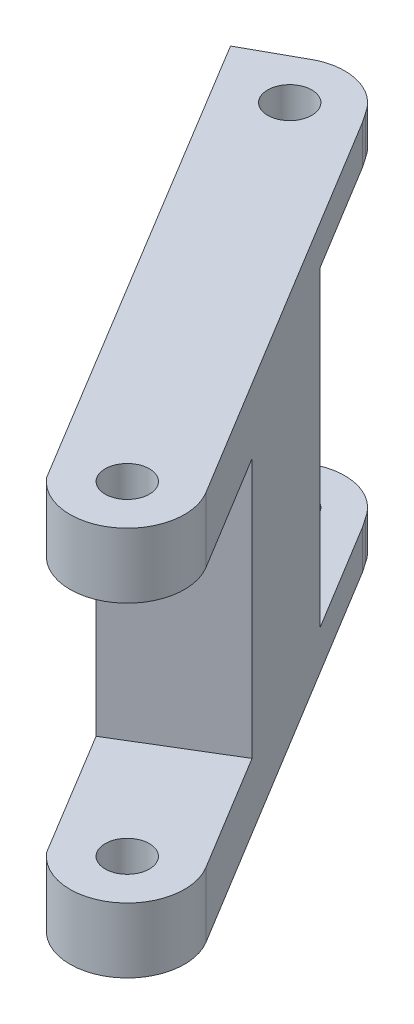
ISO-10303-21;
HEADER;
FILE_DESCRIPTION(('STEP AP214'),'2;1');
FILE_NAME('part.step','',(''),(''),'','','');
FILE_SCHEMA(('AUTOMOTIVE_DESIGN { 1 0 10303 214 1 1 1 1 }'));
ENDSEC;
DATA;
#1=APPLICATION_CONTEXT('core data for automotive mechanical design processes');
#2=APPLICATION_PROTOCOL_DEFINITION('international standard','automotive_design',2000,#1);
#3=PRODUCT_CONTEXT('',#1,'mechanical');
#4=PRODUCT('Part','Part','',(#3));
#5=PRODUCT_RELATED_PRODUCT_CATEGORY('part','',(#4));
#6=PRODUCT_DEFINITION_FORMATION('','',#4);
#7=PRODUCT_DEFINITION_CONTEXT('part definition',#1,'design');
#8=PRODUCT_DEFINITION('design','',#6,#7);
#9=PRODUCT_DEFINITION_SHAPE('','',#8);
#10=(LENGTH_UNIT() NAMED_UNIT(*) SI_UNIT(.MILLI.,.METRE.));
#11=(NAMED_UNIT(*) PLANE_ANGLE_UNIT() SI_UNIT($,.RADIAN.));
#12=(NAMED_UNIT(*) SI_UNIT($,.STERADIAN.) SOLID_ANGLE_UNIT());
#13=UNCERTAINTY_MEASURE_WITH_UNIT(LENGTH_MEASURE(1.E-05),#10,'distance_accuracy_value','');
#14=(GEOMETRIC_REPRESENTATION_CONTEXT(3) GLOBAL_UNCERTAINTY_ASSIGNED_CONTEXT((#13)) GLOBAL_UNIT_ASSIGNED_CONTEXT((#10,
#11,#12)) REPRESENTATION_CONTEXT('',''));
#15=CARTESIAN_POINT('',(0.,0.,0.));
#16=DIRECTION('',(0.,0.,1.));
#17=DIRECTION('',(1.,0.,0.));
#18=AXIS2_PLACEMENT_3D('',#15,#16,#17);
#19=CARTESIAN_POINT('',(15.902373856491,30.,-13.1472839893539));
#20=DIRECTION('',(0.,-1.,0.));
#21=DIRECTION('',(0.,0.,-0.999999999999999));
#22=AXIS2_PLACEMENT_3D('',#19,#20,#21);
#23=CYLINDRICAL_SURFACE('',#22,4.41067524674363);
#24=CARTESIAN_POINT('',(15.902373856491,25.,-13.1472839893539));
#25=DIRECTION('',(0.,1.,0.));
#26=DIRECTION('',(0.,0.,0.999999999999999));
#27=AXIS2_PLACEMENT_3D('',#24,#25,#26);
#28=CIRCLE('',#27,4.41067524674363);
#29=CARTESIAN_POINT('',(12.5391936876863,25.,-10.2936765733984));
#30=VERTEX_POINT('',#29);
#31=CARTESIAN_POINT('',(19.6718879709413,25.,-15.4374410741839));
#32=VERTEX_POINT('',#31);
#33=EDGE_CURVE('E181',#30,#32,#28,.T.);
#34=ORIENTED_EDGE('',*,*,#33,.T.);
#35=DIRECTION('',(0.,-1.,0.));
#36=VECTOR('',#35,1.);
#37=CARTESIAN_POINT('',(19.6718879709413,30.,-15.4374410741839));
#38=LINE('',#37,#36);
#39=CARTESIAN_POINT('',(19.6718879709413,30.,-15.4374410741839));
#40=VERTEX_POINT('',#39);
#41=EDGE_CURVE('E267',#40,#32,#38,.T.);
#42=ORIENTED_EDGE('',*,*,#41,.F.);
#43=CARTESIAN_POINT('',(15.902373856491,30.,-13.1472839893539));
#44=DIRECTION('',(0.,1.,0.));
#45=DIRECTION('',(0.,0.,0.999999999999999));
#46=AXIS2_PLACEMENT_3D('',#43,#44,#45);
#47=CIRCLE('',#46,4.41067524674363);
#48=CARTESIAN_POINT('',(12.5391936876863,30.,-10.2936765733984));
#49=VERTEX_POINT('',#48);
#50=EDGE_CURVE('E237',#49,#40,#47,.T.);
#51=ORIENTED_EDGE('',*,*,#50,.F.);
#52=DIRECTION('',(0.,-1.,0.));
#53=VECTOR('',#52,1.);
#54=CARTESIAN_POINT('',(12.5391936876863,30.,-10.2936765733984));
#55=LINE('',#54,#53);
#56=EDGE_CURVE('E270',#49,#30,#55,.T.);
#57=ORIENTED_EDGE('',*,*,#56,.T.);
#58=EDGE_LOOP('',(#34,#42,#51,#57));
#59=FACE_BOUND('',#58,.T.);
#60=ADVANCED_FACE('F39',(#59),#23,.T.);
#61=CARTESIAN_POINT('',(15.902373856491,30.,-13.1472839893539));
#62=DIRECTION('',(0.,-1.,0.));
#63=DIRECTION('',(0.,0.,-0.999999999999999));
#64=AXIS2_PLACEMENT_3D('',#61,#62,#63);
#65=CYLINDRICAL_SURFACE('',#64,1.7);
#66=CARTESIAN_POINT('',(15.902373856491,25.,-13.1472839893539));
#67=DIRECTION('',(0.,1.,0.));
#68=DIRECTION('',(0.,0.,0.999999999999999));
#69=AXIS2_PLACEMENT_3D('',#66,#67,#68);
#70=CIRCLE('',#69,1.7);
#71=CARTESIAN_POINT('',(15.902373856491,25.,-11.4472839893539));
#72=VERTEX_POINT('',#71);
#73=EDGE_CURVE('E183',#72,#72,#70,.T.);
#74=ORIENTED_EDGE('',*,*,#73,.F.);
#75=EDGE_LOOP('',(#74));
#76=FACE_BOUND('',#75,.T.);
#77=CARTESIAN_POINT('',(15.902373856491,30.,-13.1472839893539));
#78=DIRECTION('',(0.,1.,0.));
#79=DIRECTION('',(0.,0.,0.999999999999999));
#80=AXIS2_PLACEMENT_3D('',#77,#78,#79);
#81=CIRCLE('',#80,1.7);
#82=CARTESIAN_POINT('',(15.902373856491,30.,-11.4472839893539));
#83=VERTEX_POINT('',#82);
#84=EDGE_CURVE('E221',#83,#83,#81,.T.);
#85=ORIENTED_EDGE('',*,*,#84,.T.);
#86=EDGE_LOOP('',(#85));
#87=FACE_BOUND('',#86,.T.);
#88=ADVANCED_FACE('F360',(#76,#87),#65,.F.);
#89=CARTESIAN_POINT('',(22.2431151018936,30.,-15.3126746141976));
#90=DIRECTION('',(-0.823686793933088,0.,0.567045029517258));
#91=DIRECTION('',(0.567045029517258,0.,0.823686793933088));
#92=AXIS2_PLACEMENT_3D('',#89,#90,#91);
#93=PLANE('',#92);
#94=DIRECTION('',(0.,-1.,0.));
#95=VECTOR('',#94,1.);
#96=CARTESIAN_POINT('',(1.00187233463288,30.,-46.1675983739814));
#97=LINE('',#96,#95);
#98=CARTESIAN_POINT('',(1.00187233463288,30.,-46.1675983739814));
#99=VERTEX_POINT('',#98);
#100=CARTESIAN_POINT('',(1.00187233463288,27.,-46.1675983739814));
#101=VERTEX_POINT('',#100);
#102=EDGE_CURVE('E263',#99,#101,#97,.T.);
#103=ORIENTED_EDGE('',*,*,#102,.T.);
#104=DIRECTION('',(-0.567045029517258,0.,-0.823686793933088));
#105=VECTOR('',#104,1.);
#106=CARTESIAN_POINT('',(22.2431151018936,27.,-15.3126746141976));
#107=LINE('',#106,#105);
#108=CARTESIAN_POINT('',(0.516004793418217,27.,-46.8733671515333));
#109=VERTEX_POINT('',#108);
#110=EDGE_CURVE('E208',#101,#109,#107,.T.);
#111=ORIENTED_EDGE('',*,*,#110,.T.);
#112=DIRECTION('',(0.,-1.,0.));
#113=VECTOR('',#112,1.);
#114=CARTESIAN_POINT('',(0.516004793418217,30.,-46.8733671515333));
#115=LINE('',#114,#113);
#116=CARTESIAN_POINT('',(0.516004793418217,30.,-46.8733671515333));
#117=VERTEX_POINT('',#116);
#118=EDGE_CURVE('E282',#117,#109,#115,.T.);
#119=ORIENTED_EDGE('',*,*,#118,.F.);
#120=DIRECTION('',(-0.567045029517258,0.,-0.823686793933088));
#121=VECTOR('',#120,1.);
#122=CARTESIAN_POINT('',(22.2431151018936,30.,-15.3126746141976));
#123=LINE('',#122,#121);
#124=EDGE_CURVE('E228',#99,#117,#123,.T.);
#125=ORIENTED_EDGE('',*,*,#124,.F.);
#126=EDGE_LOOP('',(#103,#111,#119,#125));
#127=FACE_BOUND('',#126,.T.);
#128=ADVANCED_FACE('F323',(#127),#93,.F.);
#129=CARTESIAN_POINT('',(-3.11056846657485,30.,-44.670053357538));
#130=DIRECTION('',(0.,-1.,0.));
#131=DIRECTION('',(0.,0.,-0.999999999999999));
#132=AXIS2_PLACEMENT_3D('',#129,#130,#131);
#133=CYLINDRICAL_SURFACE('',#132,4.24342141259935);
#134=ORIENTED_EDGE('',*,*,#118,.T.);
#135=CARTESIAN_POINT('',(-3.11056846657484,27.,-44.670053357538));
#136=DIRECTION('',(0.,1.,0.));
#137=DIRECTION('',(0.,0.,0.999999999999999));
#138=AXIS2_PLACEMENT_3D('',#135,#136,#137);
#139=CIRCLE('',#138,4.24342141259935);
#140=CARTESIAN_POINT('',(-5.31388226057014,27.,-48.2966266175312));
#141=VERTEX_POINT('',#140);
#142=EDGE_CURVE('E211',#109,#141,#139,.T.);
#143=ORIENTED_EDGE('',*,*,#142,.T.);
#144=DIRECTION('',(0.,-1.,0.));
#145=VECTOR('',#144,1.);
#146=CARTESIAN_POINT('',(-5.31388226057013,30.,-48.2966266175311));
#147=LINE('',#146,#145);
#148=CARTESIAN_POINT('',(-5.31388226057013,30.,-48.2966266175311));
#149=VERTEX_POINT('',#148);
#150=EDGE_CURVE('E278',#149,#141,#147,.T.);
#151=ORIENTED_EDGE('',*,*,#150,.F.);
#152=CARTESIAN_POINT('',(-3.11056846657485,30.,-44.670053357538));
#153=DIRECTION('',(0.,1.,0.));
#154=DIRECTION('',(0.,0.,0.999999999999999));
#155=AXIS2_PLACEMENT_3D('',#152,#153,#154);
#156=CIRCLE('',#155,4.24342141259935);
#157=EDGE_CURVE('E231',#117,#149,#156,.T.);
#158=ORIENTED_EDGE('',*,*,#157,.F.);
#159=EDGE_LOOP('',(#134,#143,#151,#158));
#160=FACE_BOUND('',#159,.T.);
#161=ADVANCED_FACE('F319',(#160),#133,.T.);
#162=CARTESIAN_POINT('',(-21.6819075490688,30.,-39.2562921475202));
#163=DIRECTION('',(0.483474981471741,0.,0.875358179427654));
#164=DIRECTION('',(0.875358179427654,0.,-0.483474981471741));
#165=AXIS2_PLACEMENT_3D('',#162,#163,#164);
#166=PLANE('',#165);
#167=ORIENTED_EDGE('',*,*,#150,.T.);
#168=DIRECTION('',(-0.875358179427654,0.,0.483474981471741));
#169=VECTOR('',#168,1.);
#170=CARTESIAN_POINT('',(-21.6819075490688,27.,-39.2562921475202));
#171=LINE('',#170,#169);
#172=CARTESIAN_POINT('',(-9.16860558368919,27.,-46.1675983739814));
#173=VERTEX_POINT('',#172);
#174=EDGE_CURVE('E214',#141,#173,#171,.T.);
#175=ORIENTED_EDGE('',*,*,#174,.T.);
#176=DIRECTION('',(0.,-1.,0.));
#177=VECTOR('',#176,1.);
#178=CARTESIAN_POINT('',(-9.16860558368922,30.,-46.1675983739814));
#179=LINE('',#178,#177);
#180=CARTESIAN_POINT('',(-9.16860558368922,30.,-46.1675983739814));
#181=VERTEX_POINT('',#180);
#182=EDGE_CURVE('E274',#181,#173,#179,.T.);
#183=ORIENTED_EDGE('',*,*,#182,.F.);
#184=DIRECTION('',(-0.875358179427654,0.,0.483474981471741));
#185=VECTOR('',#184,1.);
#186=CARTESIAN_POINT('',(-21.6819075490688,30.,-39.2562921475202));
#187=LINE('',#186,#185);
#188=EDGE_CURVE('E233',#149,#181,#187,.T.);
#189=ORIENTED_EDGE('',*,*,#188,.F.);
#190=EDGE_LOOP('',(#167,#175,#183,#189));
#191=FACE_BOUND('',#190,.T.);
#192=ADVANCED_FACE('F314',(#191),#166,.F.);
#193=CARTESIAN_POINT('',(-3.11056846657485,30.,-44.670053357538));
#194=DIRECTION('',(0.,-1.,0.));
#195=DIRECTION('',(0.,0.,-0.999999999999999));
#196=AXIS2_PLACEMENT_3D('',#193,#194,#195);
#197=CYLINDRICAL_SURFACE('',#196,1.7);
#198=CARTESIAN_POINT('',(-3.11056846657484,27.,-44.670053357538));
#199=DIRECTION('',(0.,1.,0.));
#200=DIRECTION('',(0.,0.,0.999999999999999));
#201=AXIS2_PLACEMENT_3D('',#198,#199,#200);
#202=CIRCLE('',#201,1.7);
#203=CARTESIAN_POINT('',(-3.11056846657484,27.,-42.970053357538));
#204=VERTEX_POINT('',#203);
#205=EDGE_CURVE('E217',#204,#204,#202,.T.);
#206=ORIENTED_EDGE('',*,*,#205,.F.);
#207=EDGE_LOOP('',(#206));
#208=FACE_BOUND('',#207,.T.);
#209=CARTESIAN_POINT('',(-3.11056846657485,30.,-44.670053357538));
#210=DIRECTION('',(0.,1.,0.));
#211=DIRECTION('',(0.,0.,0.999999999999999));
#212=AXIS2_PLACEMENT_3D('',#209,#210,#211);
#213=CIRCLE('',#212,1.7);
#214=CARTESIAN_POINT('',(-3.11056846657485,30.,-42.970053357538));
#215=VERTEX_POINT('',#214);
#216=EDGE_CURVE('E224',#215,#215,#213,.T.);
#217=ORIENTED_EDGE('',*,*,#216,.T.);
#218=EDGE_LOOP('',(#217));
#219=FACE_BOUND('',#218,.T.);
#220=ADVANCED_FACE('F356',(#208,#219),#197,.F.);
#221=CARTESIAN_POINT('',(0.516004793418206,3.,-46.8733671515333));
#222=VERTEX_POINT('',#221);
#223=CARTESIAN_POINT('',(0.516004793418214,0.,-46.8733671515333));
#224=VERTEX_POINT('',#223);
#225=EDGE_CURVE('E281',#222,#224,#115,.T.);
#226=ORIENTED_EDGE('',*,*,#225,.F.);
#227=DIRECTION('',(0.567045029517258,0.,0.823686793933088));
#228=VECTOR('',#227,1.);
#229=CARTESIAN_POINT('',(22.2431151018936,3.,-15.3126746141976));
#230=LINE('',#229,#228);
#231=CARTESIAN_POINT('',(1.00187233463288,3.,-46.1675983739814));
#232=VERTEX_POINT('',#231);
#233=EDGE_CURVE('E195',#222,#232,#230,.T.);
#234=ORIENTED_EDGE('',*,*,#233,.T.);
#235=CARTESIAN_POINT('',(1.00187233463288,0.,-46.1675983739814));
#236=VERTEX_POINT('',#235);
#237=EDGE_CURVE('E241',#232,#236,#97,.T.);
#238=ORIENTED_EDGE('',*,*,#237,.T.);
#239=DIRECTION('',(-0.567045029517258,0.,-0.823686793933088));
#240=VECTOR('',#239,1.);
#241=CARTESIAN_POINT('',(22.2431151018936,0.,-15.3126746141976));
#242=LINE('',#241,#240);
#243=EDGE_CURVE('E247',#236,#224,#242,.T.);
#244=ORIENTED_EDGE('',*,*,#243,.T.);
#245=EDGE_LOOP('',(#226,#234,#238,#244));
#246=FACE_BOUND('',#245,.T.);
#247=ADVANCED_FACE('F345',(#246),#93,.F.);
#248=CARTESIAN_POINT('',(-5.31388226057014,3.,-48.2966266175312));
#249=VERTEX_POINT('',#248);
#250=CARTESIAN_POINT('',(-5.31388226057014,0.,-48.2966266175312));
#251=VERTEX_POINT('',#250);
#252=EDGE_CURVE('E277',#249,#251,#147,.T.);
#253=ORIENTED_EDGE('',*,*,#252,.F.);
#254=CARTESIAN_POINT('',(-3.11056846657485,3.,-44.670053357538));
#255=DIRECTION('',(0.,-1.,0.));
#256=DIRECTION('',(0.,0.,-0.999999999999999));
#257=AXIS2_PLACEMENT_3D('',#254,#255,#256);
#258=CIRCLE('',#257,4.24342141259935);
#259=EDGE_CURVE('E199',#249,#222,#258,.T.);
#260=ORIENTED_EDGE('',*,*,#259,.T.);
#261=ORIENTED_EDGE('',*,*,#225,.T.);
#262=CARTESIAN_POINT('',(-3.11056846657485,0.,-44.670053357538));
#263=DIRECTION('',(0.,1.,0.));
#264=DIRECTION('',(0.,0.,0.999999999999999));
#265=AXIS2_PLACEMENT_3D('',#262,#263,#264);
#266=CIRCLE('',#265,4.24342141259935);
#267=EDGE_CURVE('E250',#224,#251,#266,.T.);
#268=ORIENTED_EDGE('',*,*,#267,.T.);
#269=EDGE_LOOP('',(#253,#260,#261,#268));
#270=FACE_BOUND('',#269,.T.);
#271=ADVANCED_FACE('F348',(#270),#133,.T.);
#272=CARTESIAN_POINT('',(-9.16860558368918,3.,-46.1675983739814));
#273=VERTEX_POINT('',#272);
#274=CARTESIAN_POINT('',(-9.1686055836892,0.,-46.1675983739814));
#275=VERTEX_POINT('',#274);
#276=EDGE_CURVE('E273',#273,#275,#179,.T.);
#277=ORIENTED_EDGE('',*,*,#276,.F.);
#278=DIRECTION('',(0.875358179427654,0.,-0.483474981471741));
#279=VECTOR('',#278,1.);
#280=CARTESIAN_POINT('',(-21.6819075490688,3.,-39.2562921475202));
#281=LINE('',#280,#279);
#282=EDGE_CURVE('E202',#273,#249,#281,.T.);
#283=ORIENTED_EDGE('',*,*,#282,.T.);
#284=ORIENTED_EDGE('',*,*,#252,.T.);
#285=DIRECTION('',(-0.875358179427654,0.,0.483474981471741));
#286=VECTOR('',#285,1.);
#287=CARTESIAN_POINT('',(-21.6819075490688,0.,-39.2562921475202));
#288=LINE('',#287,#286);
#289=EDGE_CURVE('E253',#251,#275,#288,.T.);
#290=ORIENTED_EDGE('',*,*,#289,.T.);
#291=EDGE_LOOP('',(#277,#283,#284,#290));
#292=FACE_BOUND('',#291,.T.);
#293=ADVANCED_FACE('F331',(#292),#166,.F.);
#294=CARTESIAN_POINT('',(13.7377783193197,30.,-8.31291699436108));
#295=DIRECTION('',(0.855556741766655,0.,-0.517709051125846));
#296=DIRECTION('',(-0.517709051125846,0.,-0.855556741766655));
#297=AXIS2_PLACEMENT_3D('',#294,#295,#296);
#298=PLANE('',#297);
#299=DIRECTION('',(0.,-1.,0.));
#300=VECTOR('',#299,1.);
#301=CARTESIAN_POINT('',(6.69446610057534,5.,-19.9525691117226));
#302=LINE('',#301,#300);
#303=CARTESIAN_POINT('',(6.69446610057533,25.,-19.9525691117227));
#304=VERTEX_POINT('',#303);
#305=CARTESIAN_POINT('',(6.69446610057534,5.,-19.9525691117226));
#306=VERTEX_POINT('',#305);
#307=EDGE_CURVE('E163',#304,#306,#302,.T.);
#308=ORIENTED_EDGE('',*,*,#307,.F.);
#309=DIRECTION('',(-0.517709051125846,0.,-0.855556741766655));
#310=VECTOR('',#309,1.);
#311=CARTESIAN_POINT('',(6.69446610057533,25.,-19.9525691117227));
#312=LINE('',#311,#310);
#313=EDGE_CURVE('E160',#30,#304,#312,.T.);
#314=ORIENTED_EDGE('',*,*,#313,.F.);
#315=ORIENTED_EDGE('',*,*,#56,.F.);
#316=DIRECTION('',(0.517709051125846,0.,0.855556741766655));
#317=VECTOR('',#316,1.);
#318=CARTESIAN_POINT('',(13.7377783193197,30.,-8.31291699436108));
#319=LINE('',#318,#317);
#320=EDGE_CURVE('E235',#181,#49,#319,.T.);
#321=ORIENTED_EDGE('',*,*,#320,.F.);
#322=ORIENTED_EDGE('',*,*,#182,.T.);
#323=DIRECTION('',(-0.517709051125846,0.,-0.855556741766655));
#324=VECTOR('',#323,1.);
#325=CARTESIAN_POINT('',(-9.16860558368919,27.,-46.1675983739814));
#326=LINE('',#325,#324);
#327=CARTESIAN_POINT('',(-1.40296981680151,27.,-33.3342472474816));
#328=VERTEX_POINT('',#327);
#329=EDGE_CURVE('E191',#328,#173,#326,.T.);
#330=ORIENTED_EDGE('',*,*,#329,.F.);
#331=DIRECTION('',(0.,1.,0.));
#332=VECTOR('',#331,1.);
#333=CARTESIAN_POINT('',(-1.40296981680152,3.,-33.3342472474816));
#334=LINE('',#333,#332);
#335=CARTESIAN_POINT('',(-1.40296981680152,3.,-33.3342472474816));
#336=VERTEX_POINT('',#335);
#337=EDGE_CURVE('E188',#336,#328,#334,.T.);
#338=ORIENTED_EDGE('',*,*,#337,.F.);
#339=DIRECTION('',(0.517709051125846,0.,0.855556741766655));
#340=VECTOR('',#339,1.);
#341=CARTESIAN_POINT('',(-9.16860558368918,3.,-46.1675983739814));
#342=LINE('',#341,#340);
#343=EDGE_CURVE('E186',#273,#336,#342,.T.);
#344=ORIENTED_EDGE('',*,*,#343,.F.);
#345=ORIENTED_EDGE('',*,*,#276,.T.);
#346=DIRECTION('',(0.517709051125846,0.,0.855556741766655));
#347=VECTOR('',#346,1.);
#348=CARTESIAN_POINT('',(13.7377783193197,0.,-8.31291699436107));
#349=LINE('',#348,#347);
#350=CARTESIAN_POINT('',(12.5391936876864,0.,-10.2936765733984));
#351=VERTEX_POINT('',#350);
#352=EDGE_CURVE('E256',#275,#351,#349,.T.);
#353=ORIENTED_EDGE('',*,*,#352,.T.);
#354=CARTESIAN_POINT('',(12.5391936876863,5.,-10.2936765733984));
#355=VERTEX_POINT('',#354);
#356=EDGE_CURVE('E172',#355,#351,#55,.T.);
#357=ORIENTED_EDGE('',*,*,#356,.F.);
#358=DIRECTION('',(0.517709051125846,0.,0.855556741766655));
#359=VECTOR('',#358,1.);
#360=CARTESIAN_POINT('',(6.69446610057534,5.,-19.9525691117226));
#361=LINE('',#360,#359);
#362=EDGE_CURVE('E154',#306,#355,#361,.T.);
#363=ORIENTED_EDGE('',*,*,#362,.F.);
#364=EDGE_LOOP('',(#308,#314,#315,#321,#322,#330,#338,#344,#345,#353,#357,#363));
#365=FACE_BOUND('',#364,.T.);
#366=ADVANCED_FACE('F170',(#365),#298,.F.);
#367=CARTESIAN_POINT('',(15.902373856491,5.,-13.1472839893539));
#368=DIRECTION('',(0.,-1.,0.));
#369=DIRECTION('',(0.,0.,-0.999999999999999));
#370=AXIS2_PLACEMENT_3D('',#367,#368,#369);
#371=CIRCLE('',#370,4.41067524674363);
#372=CARTESIAN_POINT('',(19.6718879709413,5.,-15.4374410741839));
#373=VERTEX_POINT('',#372);
#374=EDGE_CURVE('E54',#373,#355,#371,.T.);
#375=ORIENTED_EDGE('',*,*,#374,.T.);
#376=ORIENTED_EDGE('',*,*,#356,.T.);
#377=CARTESIAN_POINT('',(15.902373856491,0.,-13.1472839893539));
#378=DIRECTION('',(0.,1.,0.));
#379=DIRECTION('',(0.,0.,0.999999999999999));
#380=AXIS2_PLACEMENT_3D('',#377,#378,#379);
#381=CIRCLE('',#380,4.41067524674363);
#382=CARTESIAN_POINT('',(19.6718879709413,0.,-15.4374410741839));
#383=VERTEX_POINT('',#382);
#384=EDGE_CURVE('E258',#351,#383,#381,.T.);
#385=ORIENTED_EDGE('',*,*,#384,.T.);
#386=EDGE_CURVE('E266',#373,#383,#38,.T.);
#387=ORIENTED_EDGE('',*,*,#386,.F.);
#388=EDGE_LOOP('',(#375,#376,#385,#387));
#389=FACE_BOUND('',#388,.T.);
#390=ADVANCED_FACE('F342',(#389),#23,.T.);
#391=CARTESIAN_POINT('',(-3.11056846657485,3.,-44.670053357538));
#392=DIRECTION('',(0.,-1.,0.));
#393=DIRECTION('',(0.,0.,-0.999999999999999));
#394=AXIS2_PLACEMENT_3D('',#391,#392,#393);
#395=CIRCLE('',#394,1.7);
#396=CARTESIAN_POINT('',(-3.11056846657485,3.,-46.370053357538));
#397=VERTEX_POINT('',#396);
#398=EDGE_CURVE('E205',#397,#397,#395,.T.);
#399=ORIENTED_EDGE('',*,*,#398,.F.);
#400=EDGE_LOOP('',(#399));
#401=FACE_BOUND('',#400,.T.);
#402=CARTESIAN_POINT('',(-3.11056846657485,0.,-44.670053357538));
#403=DIRECTION('',(0.,1.,0.));
#404=DIRECTION('',(0.,0.,0.999999999999999));
#405=AXIS2_PLACEMENT_3D('',#402,#403,#404);
#406=CIRCLE('',#405,1.7);
#407=CARTESIAN_POINT('',(-3.11056846657485,0.,-42.970053357538));
#408=VERTEX_POINT('',#407);
#409=EDGE_CURVE('E244',#408,#408,#406,.T.);
#410=ORIENTED_EDGE('',*,*,#409,.F.);
#411=EDGE_LOOP('',(#410));
#412=FACE_BOUND('',#411,.T.);
#413=ADVANCED_FACE('F369',(#401,#412),#197,.F.);
#414=CARTESIAN_POINT('',(15.902373856491,5.,-13.1472839893539));
#415=DIRECTION('',(0.,-1.,0.));
#416=DIRECTION('',(0.,0.,-0.999999999999999));
#417=AXIS2_PLACEMENT_3D('',#414,#415,#416);
#418=CIRCLE('',#417,1.7);
#419=CARTESIAN_POINT('',(15.902373856491,5.,-14.8472839893539));
#420=VERTEX_POINT('',#419);
#421=EDGE_CURVE('E178',#420,#420,#418,.T.);
#422=ORIENTED_EDGE('',*,*,#421,.F.);
#423=EDGE_LOOP('',(#422));
#424=FACE_BOUND('',#423,.T.);
#425=CARTESIAN_POINT('',(15.902373856491,0.,-13.1472839893539));
#426=DIRECTION('',(0.,1.,0.));
#427=DIRECTION('',(0.,0.,0.999999999999999));
#428=AXIS2_PLACEMENT_3D('',#425,#426,#427);
#429=CIRCLE('',#428,1.7);
#430=CARTESIAN_POINT('',(15.902373856491,0.,-11.4472839893539));
#431=VERTEX_POINT('',#430);
#432=EDGE_CURVE('E220',#431,#431,#429,.T.);
#433=ORIENTED_EDGE('',*,*,#432,.F.);
#434=EDGE_LOOP('',(#433));
#435=FACE_BOUND('',#434,.T.);
#436=ADVANCED_FACE('F41',(#424,#435),#65,.F.);
#437=CARTESIAN_POINT('',(21.2187388097982,30.,-12.8913816319543));
#438=DIRECTION('',(-0.854634246135732,0.,0.519230493453539));
#439=DIRECTION('',(0.519230493453539,0.,0.854634246135732));
#440=AXIS2_PLACEMENT_3D('',#437,#438,#439);
#441=PLANE('',#440);
#442=ORIENTED_EDGE('',*,*,#41,.T.);
#443=DIRECTION('',(-0.519230493453539,0.,-0.854634246135732));
#444=VECTOR('',#443,1.);
#445=CARTESIAN_POINT('',(21.2187388097982,25.,-12.8913816319543));
#446=LINE('',#445,#444);
#447=CARTESIAN_POINT('',(14.1776537525663,25.,-24.4807480034104));
#448=VERTEX_POINT('',#447);
#449=EDGE_CURVE('E11',#32,#448,#446,.T.);
#450=ORIENTED_EDGE('',*,*,#449,.T.);
#451=DIRECTION('',(0.,-1.,0.));
#452=VECTOR('',#451,1.);
#453=CARTESIAN_POINT('',(14.1776537525663,30.,-24.4807480034103));
#454=LINE('',#453,#452);
#455=CARTESIAN_POINT('',(14.1776537525663,5.,-24.4807480034104));
#456=VERTEX_POINT('',#455);
#457=EDGE_CURVE('E47',#448,#456,#454,.T.);
#458=ORIENTED_EDGE('',*,*,#457,.T.);
#459=DIRECTION('',(0.519230493453539,0.,0.854634246135732));
#460=VECTOR('',#459,1.);
#461=CARTESIAN_POINT('',(21.2187388097982,5.,-12.8913816319543));
#462=LINE('',#461,#460);
#463=EDGE_CURVE('E156',#456,#373,#462,.T.);
#464=ORIENTED_EDGE('',*,*,#463,.T.);
#465=ORIENTED_EDGE('',*,*,#386,.T.);
#466=DIRECTION('',(-0.519230493453539,0.,-0.854634246135732));
#467=VECTOR('',#466,1.);
#468=CARTESIAN_POINT('',(21.2187388097982,0.,-12.8913816319543));
#469=LINE('',#468,#467);
#470=EDGE_CURVE('E225',#383,#236,#469,.T.);
#471=ORIENTED_EDGE('',*,*,#470,.T.);
#472=ORIENTED_EDGE('',*,*,#237,.F.);
#473=DIRECTION('',(0.519230493453539,0.,0.854634246135732));
#474=VECTOR('',#473,1.);
#475=CARTESIAN_POINT('',(21.2187388097982,3.,-12.8913816319543));
#476=LINE('',#475,#474);
#477=CARTESIAN_POINT('',(6.05640825159463,3.,-37.8480186354599));
#478=VERTEX_POINT('',#477);
#479=EDGE_CURVE('E285',#232,#478,#476,.T.);
#480=ORIENTED_EDGE('',*,*,#479,.T.);
#481=DIRECTION('',(0.,1.,0.));
#482=VECTOR('',#481,1.);
#483=CARTESIAN_POINT('',(6.05640825159462,30.,-37.8480186354599));
#484=LINE('',#483,#482);
#485=CARTESIAN_POINT('',(6.0564082515946,27.,-37.84801863546));
#486=VERTEX_POINT('',#485);
#487=EDGE_CURVE('E288',#478,#486,#484,.T.);
#488=ORIENTED_EDGE('',*,*,#487,.T.);
#489=DIRECTION('',(-0.519230493453539,0.,-0.854634246135732));
#490=VECTOR('',#489,1.);
#491=CARTESIAN_POINT('',(21.2187388097982,27.,-12.8913816319543));
#492=LINE('',#491,#490);
#493=EDGE_CURVE('E291',#486,#101,#492,.T.);
#494=ORIENTED_EDGE('',*,*,#493,.T.);
#495=ORIENTED_EDGE('',*,*,#102,.F.);
#496=DIRECTION('',(-0.519230493453539,0.,-0.854634246135732));
#497=VECTOR('',#496,1.);
#498=CARTESIAN_POINT('',(21.2187388097982,30.,-12.8913816319543));
#499=LINE('',#498,#497);
#500=EDGE_CURVE('E239',#40,#99,#499,.T.);
#501=ORIENTED_EDGE('',*,*,#500,.F.);
#502=EDGE_LOOP('',(#442,#450,#458,#464,#465,#471,#472,#480,#488,#494,#495,#501));
#503=FACE_BOUND('',#502,.T.);
#504=ADVANCED_FACE('F295',(#503),#441,.F.);
#505=CARTESIAN_POINT('',(0.,30.,0.));
#506=DIRECTION('',(0.,1.,0.));
#507=DIRECTION('',(0.,0.,0.999999999999999));
#508=AXIS2_PLACEMENT_3D('',#505,#506,#507);
#509=PLANE('',#508);
#510=ORIENTED_EDGE('',*,*,#84,.F.);
#511=EDGE_LOOP('',(#510));
#512=FACE_BOUND('',#511,.T.);
#513=ORIENTED_EDGE('',*,*,#216,.F.);
#514=EDGE_LOOP('',(#513));
#515=FACE_BOUND('',#514,.T.);
#516=ORIENTED_EDGE('',*,*,#124,.T.);
#517=ORIENTED_EDGE('',*,*,#157,.T.);
#518=ORIENTED_EDGE('',*,*,#188,.T.);
#519=ORIENTED_EDGE('',*,*,#320,.T.);
#520=ORIENTED_EDGE('',*,*,#50,.T.);
#521=ORIENTED_EDGE('',*,*,#500,.T.);
#522=EDGE_LOOP('',(#516,#517,#518,#519,#520,#521));
#523=FACE_BOUND('',#522,.T.);
#524=ADVANCED_FACE('F307',(#512,#515,#523),#509,.T.);
#525=CARTESIAN_POINT('',(0.,0.,0.));
#526=DIRECTION('',(0.,1.,0.));
#527=DIRECTION('',(0.,0.,0.999999999999999));
#528=AXIS2_PLACEMENT_3D('',#525,#526,#527);
#529=PLANE('',#528);
#530=ORIENTED_EDGE('',*,*,#432,.T.);
#531=EDGE_LOOP('',(#530));
#532=FACE_BOUND('',#531,.T.);
#533=ORIENTED_EDGE('',*,*,#409,.T.);
#534=EDGE_LOOP('',(#533));
#535=FACE_BOUND('',#534,.T.);
#536=ORIENTED_EDGE('',*,*,#243,.F.);
#537=ORIENTED_EDGE('',*,*,#470,.F.);
#538=ORIENTED_EDGE('',*,*,#384,.F.);
#539=ORIENTED_EDGE('',*,*,#352,.F.);
#540=ORIENTED_EDGE('',*,*,#289,.F.);
#541=ORIENTED_EDGE('',*,*,#267,.F.);
#542=EDGE_LOOP('',(#536,#537,#538,#539,#540,#541));
#543=FACE_BOUND('',#542,.T.);
#544=ADVANCED_FACE('F339',(#532,#535,#543),#529,.F.);
#545=CARTESIAN_POINT('',(16.4980966693105,27.,-61.6988699077568));
#546=DIRECTION('',(0.,1.,0.));
#547=DIRECTION('',(0.,0.,0.999999999999999));
#548=AXIS2_PLACEMENT_3D('',#545,#546,#547);
#549=PLANE('',#548);
#550=ORIENTED_EDGE('',*,*,#205,.T.);
#551=EDGE_LOOP('',(#550));
#552=FACE_BOUND('',#551,.T.);
#553=ORIENTED_EDGE('',*,*,#142,.F.);
#554=ORIENTED_EDGE('',*,*,#110,.F.);
#555=ORIENTED_EDGE('',*,*,#493,.F.);
#556=DIRECTION('',(-0.855556741766655,0.,0.517709051125845));
#557=VECTOR('',#556,1.);
#558=CARTESIAN_POINT('',(24.2637324361982,27.,-48.865518781257));
#559=LINE('',#558,#557);
#560=EDGE_CURVE('E193',#486,#328,#559,.T.);
#561=ORIENTED_EDGE('',*,*,#560,.T.);
#562=ORIENTED_EDGE('',*,*,#329,.T.);
#563=ORIENTED_EDGE('',*,*,#174,.F.);
#564=EDGE_LOOP('',(#553,#554,#555,#561,#562,#563));
#565=FACE_BOUND('',#564,.T.);
#566=ADVANCED_FACE('F317',(#552,#565),#549,.F.);
#567=CARTESIAN_POINT('',(24.2637324361982,3.,-48.865518781257));
#568=DIRECTION('',(0.517709051125845,0.,0.855556741766655));
#569=DIRECTION('',(0.855556741766655,0.,-0.517709051125846));
#570=AXIS2_PLACEMENT_3D('',#567,#568,#569);
#571=PLANE('',#570);
#572=DIRECTION('',(-0.855556741766655,0.,0.517709051125845));
#573=VECTOR('',#572,1.);
#574=CARTESIAN_POINT('',(24.2637324361982,3.,-48.865518781257));
#575=LINE('',#574,#573);
#576=EDGE_CURVE('E62',#478,#336,#575,.T.);
#577=ORIENTED_EDGE('',*,*,#576,.T.);
#578=ORIENTED_EDGE('',*,*,#337,.T.);
#579=ORIENTED_EDGE('',*,*,#560,.F.);
#580=ORIENTED_EDGE('',*,*,#487,.F.);
#581=EDGE_LOOP('',(#577,#578,#579,#580));
#582=FACE_BOUND('',#581,.T.);
#583=ADVANCED_FACE('F327',(#582),#571,.F.);
#584=CARTESIAN_POINT('',(16.4980966693105,3.,-61.6988699077568));
#585=DIRECTION('',(0.,-1.,0.));
#586=DIRECTION('',(0.,0.,-0.999999999999999));
#587=AXIS2_PLACEMENT_3D('',#584,#585,#586);
#588=PLANE('',#587);
#589=ORIENTED_EDGE('',*,*,#398,.T.);
#590=EDGE_LOOP('',(#589));
#591=FACE_BOUND('',#590,.T.);
#592=ORIENTED_EDGE('',*,*,#343,.T.);
#593=ORIENTED_EDGE('',*,*,#576,.F.);
#594=ORIENTED_EDGE('',*,*,#479,.F.);
#595=ORIENTED_EDGE('',*,*,#233,.F.);
#596=ORIENTED_EDGE('',*,*,#259,.F.);
#597=ORIENTED_EDGE('',*,*,#282,.F.);
#598=EDGE_LOOP('',(#592,#593,#594,#595,#596,#597));
#599=FACE_BOUND('',#598,.T.);
#600=ADVANCED_FACE('F346',(#591,#599),#588,.F.);
#601=CARTESIAN_POINT('',(32.361168353575,5.,-35.4838406454981));
#602=DIRECTION('',(-0.517709051125845,0.,-0.855556741766655));
#603=DIRECTION('',(-0.855556741766655,0.,0.517709051125846));
#604=AXIS2_PLACEMENT_3D('',#601,#602,#603);
#605=PLANE('',#604);
#606=DIRECTION('',(-0.855556741766655,0.,0.517709051125845));
#607=VECTOR('',#606,1.);
#608=CARTESIAN_POINT('',(32.3611683535751,25.,-35.4838406454981));
#609=LINE('',#608,#607);
#610=EDGE_CURVE('E159',#448,#304,#609,.T.);
#611=ORIENTED_EDGE('',*,*,#610,.T.);
#612=ORIENTED_EDGE('',*,*,#307,.T.);
#613=DIRECTION('',(-0.855556741766655,0.,0.517709051125845));
#614=VECTOR('',#613,1.);
#615=CARTESIAN_POINT('',(32.361168353575,5.,-35.4838406454981));
#616=LINE('',#615,#614);
#617=EDGE_CURVE('E150',#456,#306,#616,.T.);
#618=ORIENTED_EDGE('',*,*,#617,.F.);
#619=ORIENTED_EDGE('',*,*,#457,.F.);
#620=EDGE_LOOP('',(#611,#612,#618,#619));
#621=FACE_BOUND('',#620,.T.);
#622=ADVANCED_FACE('F164',(#621),#605,.F.);
#623=CARTESIAN_POINT('',(32.3611683535751,25.,-35.4838406454981));
#624=DIRECTION('',(0.,1.,0.));
#625=DIRECTION('',(0.,0.,0.999999999999999));
#626=AXIS2_PLACEMENT_3D('',#623,#624,#625);
#627=PLANE('',#626);
#628=ORIENTED_EDGE('',*,*,#73,.T.);
#629=EDGE_LOOP('',(#628));
#630=FACE_BOUND('',#629,.T.);
#631=ORIENTED_EDGE('',*,*,#313,.T.);
#632=ORIENTED_EDGE('',*,*,#610,.F.);
#633=ORIENTED_EDGE('',*,*,#449,.F.);
#634=ORIENTED_EDGE('',*,*,#33,.F.);
#635=EDGE_LOOP('',(#631,#632,#633,#634));
#636=FACE_BOUND('',#635,.T.);
#637=ADVANCED_FACE('F299',(#630,#636),#627,.F.);
#638=CARTESIAN_POINT('',(32.361168353575,5.,-35.4838406454981));
#639=DIRECTION('',(0.,-1.,0.));
#640=DIRECTION('',(0.,0.,-0.999999999999999));
#641=AXIS2_PLACEMENT_3D('',#638,#639,#640);
#642=PLANE('',#641);
#643=ORIENTED_EDGE('',*,*,#421,.T.);
#644=EDGE_LOOP('',(#643));
#645=FACE_BOUND('',#644,.T.);
#646=ORIENTED_EDGE('',*,*,#374,.F.);
#647=ORIENTED_EDGE('',*,*,#463,.F.);
#648=ORIENTED_EDGE('',*,*,#617,.T.);
#649=ORIENTED_EDGE('',*,*,#362,.T.);
#650=EDGE_LOOP('',(#646,#647,#648,#649));
#651=FACE_BOUND('',#650,.T.);
#652=ADVANCED_FACE('F152',(#645,#651),#642,.F.);
#653=CLOSED_SHELL('',(#60,#88,#128,#161,#192,#220,#247,#271,#293,#366,#390,#413,#436,#504,#524,
#544,#566,#583,#600,#622,#637,#652));
#654=MANIFOLD_SOLID_BREP('B2',#653);
#655=ADVANCED_BREP_SHAPE_REPRESENTATION('',(#18,#654),#14);
#656=SHAPE_DEFINITION_REPRESENTATION(#9,#655);
ENDSEC;
END-ISO-10303-21;
